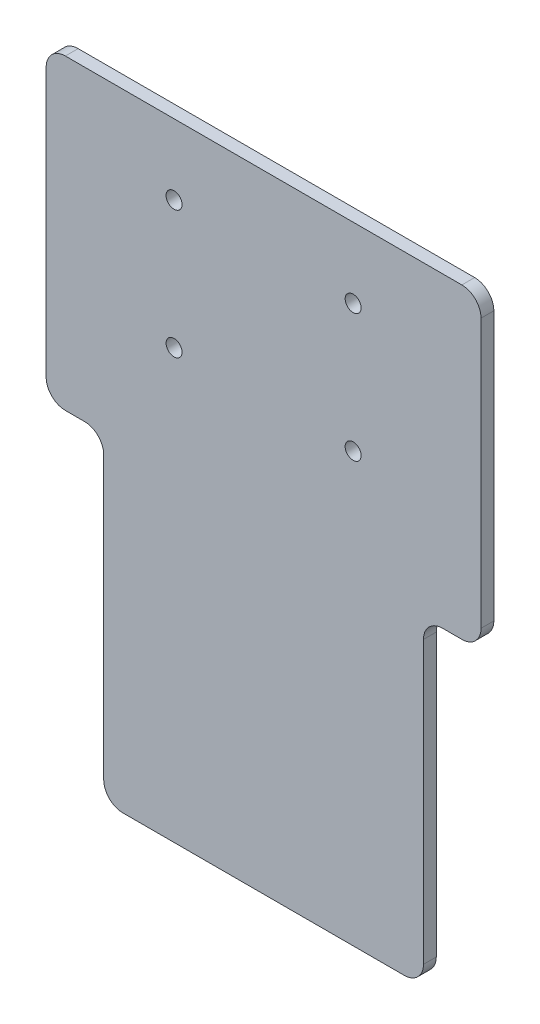
ISO-10303-21;
HEADER;
FILE_DESCRIPTION(('STEP AP214'),'2;1');
FILE_NAME('part.step','',(''),(''),'','','');
FILE_SCHEMA(('AUTOMOTIVE_DESIGN { 1 0 10303 214 1 1 1 1 }'));
ENDSEC;
DATA;
#1=APPLICATION_CONTEXT('core data for automotive mechanical design processes');
#2=APPLICATION_PROTOCOL_DEFINITION('international standard','automotive_design',2000,#1);
#3=PRODUCT_CONTEXT('',#1,'mechanical');
#4=PRODUCT('Part','Part','',(#3));
#5=PRODUCT_RELATED_PRODUCT_CATEGORY('part','',(#4));
#6=PRODUCT_DEFINITION_FORMATION('','',#4);
#7=PRODUCT_DEFINITION_CONTEXT('part definition',#1,'design');
#8=PRODUCT_DEFINITION('design','',#6,#7);
#9=PRODUCT_DEFINITION_SHAPE('','',#8);
#10=(LENGTH_UNIT() NAMED_UNIT(*) SI_UNIT(.MILLI.,.METRE.));
#11=(NAMED_UNIT(*) PLANE_ANGLE_UNIT() SI_UNIT($,.RADIAN.));
#12=(NAMED_UNIT(*) SI_UNIT($,.STERADIAN.) SOLID_ANGLE_UNIT());
#13=UNCERTAINTY_MEASURE_WITH_UNIT(LENGTH_MEASURE(1.E-05),#10,'distance_accuracy_value','');
#14=(GEOMETRIC_REPRESENTATION_CONTEXT(3) GLOBAL_UNCERTAINTY_ASSIGNED_CONTEXT((#13)) GLOBAL_UNIT_ASSIGNED_CONTEXT((#10,
#11,#12)) REPRESENTATION_CONTEXT('',''));
#15=CARTESIAN_POINT('',(0.,0.,0.));
#16=DIRECTION('',(0.,0.,1.));
#17=DIRECTION('',(1.,0.,0.));
#18=AXIS2_PLACEMENT_3D('',#15,#16,#17);
#19=CARTESIAN_POINT('',(0.,0.,2.));
#20=DIRECTION('',(0.,0.,-1.));
#21=DIRECTION('',(-1.,0.,0.));
#22=AXIS2_PLACEMENT_3D('',#19,#20,#21);
#23=PLANE('',#22);
#24=DIRECTION('',(0.,1.,0.));
#25=VECTOR('',#24,1.);
#26=CARTESIAN_POINT('',(9.,10.,2.));
#27=LINE('',#26,#25);
#28=CARTESIAN_POINT('',(9.,-37.,2.));
#29=VERTEX_POINT('',#28);
#30=CARTESIAN_POINT('',(9.,7.00000000000003,2.));
#31=VERTEX_POINT('',#30);
#32=EDGE_CURVE('E172',#29,#31,#27,.T.);
#33=ORIENTED_EDGE('',*,*,#32,.F.);
#34=CARTESIAN_POINT('',(12.,-37.,2.));
#35=DIRECTION('',(0.,0.,-1.));
#36=DIRECTION('',(-1.,0.,0.));
#37=AXIS2_PLACEMENT_3D('',#34,#35,#36);
#38=CIRCLE('',#37,3.);
#39=CARTESIAN_POINT('',(12.,-40.,2.));
#40=VERTEX_POINT('',#39);
#41=EDGE_CURVE('E279',#29,#40,#38,.F.);
#42=ORIENTED_EDGE('',*,*,#41,.T.);
#43=DIRECTION('',(1.,0.,0.));
#44=VECTOR('',#43,1.);
#45=CARTESIAN_POINT('',(-40.0499687890016,-40.,2.));
#46=LINE('',#45,#44);
#47=CARTESIAN_POINT('',(56.,-40.,2.));
#48=VERTEX_POINT('',#47);
#49=EDGE_CURVE('E223',#40,#48,#46,.T.);
#50=ORIENTED_EDGE('',*,*,#49,.T.);
#51=CARTESIAN_POINT('',(56.,-37.,2.));
#52=DIRECTION('',(0.,0.,-1.));
#53=DIRECTION('',(-1.,0.,0.));
#54=AXIS2_PLACEMENT_3D('',#51,#52,#53);
#55=CIRCLE('',#54,3.);
#56=CARTESIAN_POINT('',(59.,-37.,2.));
#57=VERTEX_POINT('',#56);
#58=EDGE_CURVE('E277',#48,#57,#55,.F.);
#59=ORIENTED_EDGE('',*,*,#58,.T.);
#60=DIRECTION('',(0.,-1.,0.));
#61=VECTOR('',#60,1.);
#62=CARTESIAN_POINT('',(59.,10.,2.));
#63=LINE('',#62,#61);
#64=CARTESIAN_POINT('',(59.,7.00000000000003,2.));
#65=VERTEX_POINT('',#64);
#66=EDGE_CURVE('E214',#65,#57,#63,.T.);
#67=ORIENTED_EDGE('',*,*,#66,.F.);
#68=CARTESIAN_POINT('',(62.,7.00000000000003,2.));
#69=DIRECTION('',(0.,0.,-1.));
#70=DIRECTION('',(-1.,0.,0.));
#71=AXIS2_PLACEMENT_3D('',#68,#69,#70);
#72=CIRCLE('',#71,3.);
#73=CARTESIAN_POINT('',(62.,10.,2.));
#74=VERTEX_POINT('',#73);
#75=EDGE_CURVE('E195',#65,#74,#72,.T.);
#76=ORIENTED_EDGE('',*,*,#75,.T.);
#77=DIRECTION('',(-1.,0.,0.));
#78=VECTOR('',#77,1.);
#79=CARTESIAN_POINT('',(68.,10.,2.));
#80=LINE('',#79,#78);
#81=CARTESIAN_POINT('',(65.,10.,2.));
#82=VERTEX_POINT('',#81);
#83=EDGE_CURVE('E211',#82,#74,#80,.T.);
#84=ORIENTED_EDGE('',*,*,#83,.F.);
#85=CARTESIAN_POINT('',(65.,13.,2.));
#86=DIRECTION('',(0.,0.,-1.));
#87=DIRECTION('',(-1.,0.,0.));
#88=AXIS2_PLACEMENT_3D('',#85,#86,#87);
#89=CIRCLE('',#88,3.);
#90=CARTESIAN_POINT('',(68.,13.,2.));
#91=VERTEX_POINT('',#90);
#92=EDGE_CURVE('E270',#82,#91,#89,.F.);
#93=ORIENTED_EDGE('',*,*,#92,.T.);
#94=DIRECTION('',(0.,1.,0.));
#95=VECTOR('',#94,1.);
#96=CARTESIAN_POINT('',(68.,0.,2.));
#97=LINE('',#96,#95);
#98=CARTESIAN_POINT('',(68.,55.,2.));
#99=VERTEX_POINT('',#98);
#100=EDGE_CURVE('E256',#91,#99,#97,.T.);
#101=ORIENTED_EDGE('',*,*,#100,.T.);
#102=CARTESIAN_POINT('',(65.,55.,2.));
#103=DIRECTION('',(0.,0.,-1.));
#104=DIRECTION('',(-1.,0.,0.));
#105=AXIS2_PLACEMENT_3D('',#102,#103,#104);
#106=CIRCLE('',#105,3.);
#107=CARTESIAN_POINT('',(65.,58.,2.));
#108=VERTEX_POINT('',#107);
#109=EDGE_CURVE('E275',#99,#108,#106,.F.);
#110=ORIENTED_EDGE('',*,*,#109,.T.);
#111=DIRECTION('',(-1.,0.,0.));
#112=VECTOR('',#111,1.);
#113=CARTESIAN_POINT('',(0.,58.,2.));
#114=LINE('',#113,#112);
#115=CARTESIAN_POINT('',(3.,58.,2.));
#116=VERTEX_POINT('',#115);
#117=EDGE_CURVE('E176',#108,#116,#114,.T.);
#118=ORIENTED_EDGE('',*,*,#117,.T.);
#119=CARTESIAN_POINT('',(3.,55.,2.));
#120=DIRECTION('',(0.,0.,-1.));
#121=DIRECTION('',(-1.,0.,0.));
#122=AXIS2_PLACEMENT_3D('',#119,#120,#121);
#123=CIRCLE('',#122,3.);
#124=CARTESIAN_POINT('',(0.,55.,2.));
#125=VERTEX_POINT('',#124);
#126=EDGE_CURVE('E273',#116,#125,#123,.F.);
#127=ORIENTED_EDGE('',*,*,#126,.T.);
#128=DIRECTION('',(0.,-1.,0.));
#129=VECTOR('',#128,1.);
#130=CARTESIAN_POINT('',(0.,0.,2.));
#131=LINE('',#130,#129);
#132=CARTESIAN_POINT('',(0.,13.,2.));
#133=VERTEX_POINT('',#132);
#134=EDGE_CURVE('E254',#125,#133,#131,.T.);
#135=ORIENTED_EDGE('',*,*,#134,.T.);
#136=CARTESIAN_POINT('',(3.,13.,2.));
#137=DIRECTION('',(0.,0.,-1.));
#138=DIRECTION('',(-1.,0.,0.));
#139=AXIS2_PLACEMENT_3D('',#136,#137,#138);
#140=CIRCLE('',#139,3.);
#141=CARTESIAN_POINT('',(3.,10.,2.));
#142=VERTEX_POINT('',#141);
#143=EDGE_CURVE('E207',#133,#142,#140,.F.);
#144=ORIENTED_EDGE('',*,*,#143,.T.);
#145=DIRECTION('',(-1.,0.,0.));
#146=VECTOR('',#145,1.);
#147=CARTESIAN_POINT('',(0.,10.,2.));
#148=LINE('',#147,#146);
#149=CARTESIAN_POINT('',(6.,10.,2.));
#150=VERTEX_POINT('',#149);
#151=EDGE_CURVE('E205',#150,#142,#148,.T.);
#152=ORIENTED_EDGE('',*,*,#151,.F.);
#153=CARTESIAN_POINT('',(6.,7.00000000000003,2.));
#154=DIRECTION('',(0.,0.,-1.));
#155=DIRECTION('',(-1.,0.,0.));
#156=AXIS2_PLACEMENT_3D('',#153,#154,#155);
#157=CIRCLE('',#156,3.);
#158=EDGE_CURVE('E57',#150,#31,#157,.T.);
#159=ORIENTED_EDGE('',*,*,#158,.T.);
#160=EDGE_LOOP('',(#33,#42,#50,#59,#67,#76,#84,#93,#101,#110,#118,#127,#135,#144,#152,#159));
#161=FACE_BOUND('',#160,.T.);
#162=CARTESIAN_POINT('',(48.,27.,2.));
#163=DIRECTION('',(0.,0.,1.));
#164=DIRECTION('',(1.,0.,0.));
#165=AXIS2_PLACEMENT_3D('',#162,#163,#164);
#166=CIRCLE('',#165,1.25);
#167=CARTESIAN_POINT('',(49.25,27.,2.));
#168=VERTEX_POINT('',#167);
#169=EDGE_CURVE('E248',#168,#168,#166,.T.);
#170=ORIENTED_EDGE('',*,*,#169,.F.);
#171=EDGE_LOOP('',(#170));
#172=FACE_BOUND('',#171,.T.);
#173=CARTESIAN_POINT('',(20.,27.,2.));
#174=DIRECTION('',(0.,0.,1.));
#175=DIRECTION('',(-1.,0.,0.));
#176=AXIS2_PLACEMENT_3D('',#173,#174,#175);
#177=CIRCLE('',#176,1.25);
#178=CARTESIAN_POINT('',(18.75,27.,2.));
#179=VERTEX_POINT('',#178);
#180=EDGE_CURVE('E242',#179,#179,#177,.T.);
#181=ORIENTED_EDGE('',*,*,#180,.F.);
#182=EDGE_LOOP('',(#181));
#183=FACE_BOUND('',#182,.T.);
#184=CARTESIAN_POINT('',(48.,47.,2.));
#185=DIRECTION('',(0.,0.,1.));
#186=DIRECTION('',(1.,0.,0.));
#187=AXIS2_PLACEMENT_3D('',#184,#185,#186);
#188=CIRCLE('',#187,1.25);
#189=CARTESIAN_POINT('',(49.25,47.,2.));
#190=VERTEX_POINT('',#189);
#191=EDGE_CURVE('E236',#190,#190,#188,.T.);
#192=ORIENTED_EDGE('',*,*,#191,.F.);
#193=EDGE_LOOP('',(#192));
#194=FACE_BOUND('',#193,.T.);
#195=CARTESIAN_POINT('',(20.,47.,2.));
#196=DIRECTION('',(0.,0.,1.));
#197=DIRECTION('',(-1.,0.,0.));
#198=AXIS2_PLACEMENT_3D('',#195,#196,#197);
#199=CIRCLE('',#198,1.25);
#200=CARTESIAN_POINT('',(18.75,47.,2.));
#201=VERTEX_POINT('',#200);
#202=EDGE_CURVE('E230',#201,#201,#199,.T.);
#203=ORIENTED_EDGE('',*,*,#202,.F.);
#204=EDGE_LOOP('',(#203));
#205=FACE_BOUND('',#204,.T.);
#206=ADVANCED_FACE('F49',(#161,#172,#183,#194,#205),#23,.F.);
#207=CARTESIAN_POINT('',(0.,0.,0.));
#208=DIRECTION('',(0.,0.,-1.));
#209=DIRECTION('',(-1.,0.,0.));
#210=AXIS2_PLACEMENT_3D('',#207,#208,#209);
#211=PLANE('',#210);
#212=DIRECTION('',(1.,0.,0.));
#213=VECTOR('',#212,1.);
#214=CARTESIAN_POINT('',(-40.0499687890016,-40.,2.79318507107451E-13));
#215=LINE('',#214,#213);
#216=CARTESIAN_POINT('',(12.,-40.,2.79318507107451E-13));
#217=VERTEX_POINT('',#216);
#218=CARTESIAN_POINT('',(56.,-40.,2.79318507107451E-13));
#219=VERTEX_POINT('',#218);
#220=EDGE_CURVE('E224',#217,#219,#215,.T.);
#221=ORIENTED_EDGE('',*,*,#220,.F.);
#222=CARTESIAN_POINT('',(12.,-37.,0.));
#223=DIRECTION('',(0.,0.,-1.));
#224=DIRECTION('',(-1.,0.,0.));
#225=AXIS2_PLACEMENT_3D('',#222,#223,#224);
#226=CIRCLE('',#225,3.);
#227=CARTESIAN_POINT('',(9.,-37.,0.));
#228=VERTEX_POINT('',#227);
#229=EDGE_CURVE('E184',#217,#228,#226,.T.);
#230=ORIENTED_EDGE('',*,*,#229,.T.);
#231=DIRECTION('',(0.,-1.,0.));
#232=VECTOR('',#231,1.);
#233=CARTESIAN_POINT('',(9.,0.,0.));
#234=LINE('',#233,#232);
#235=CARTESIAN_POINT('',(9.,7.00000000000003,0.));
#236=VERTEX_POINT('',#235);
#237=EDGE_CURVE('E169',#236,#228,#234,.T.);
#238=ORIENTED_EDGE('',*,*,#237,.F.);
#239=CARTESIAN_POINT('',(6.,7.00000000000003,0.));
#240=DIRECTION('',(0.,0.,-1.));
#241=DIRECTION('',(-1.,0.,0.));
#242=AXIS2_PLACEMENT_3D('',#239,#240,#241);
#243=CIRCLE('',#242,3.);
#244=CARTESIAN_POINT('',(6.,10.,0.));
#245=VERTEX_POINT('',#244);
#246=EDGE_CURVE('E11',#236,#245,#243,.F.);
#247=ORIENTED_EDGE('',*,*,#246,.T.);
#248=DIRECTION('',(1.,0.,0.));
#249=VECTOR('',#248,1.);
#250=CARTESIAN_POINT('',(0.,10.,0.));
#251=LINE('',#250,#249);
#252=CARTESIAN_POINT('',(3.,10.,0.));
#253=VERTEX_POINT('',#252);
#254=EDGE_CURVE('E221',#253,#245,#251,.T.);
#255=ORIENTED_EDGE('',*,*,#254,.F.);
#256=CARTESIAN_POINT('',(3.,13.,0.));
#257=DIRECTION('',(0.,0.,-1.));
#258=DIRECTION('',(-1.,0.,0.));
#259=AXIS2_PLACEMENT_3D('',#256,#257,#258);
#260=CIRCLE('',#259,3.);
#261=CARTESIAN_POINT('',(0.,13.,0.));
#262=VERTEX_POINT('',#261);
#263=EDGE_CURVE('E287',#253,#262,#260,.T.);
#264=ORIENTED_EDGE('',*,*,#263,.T.);
#265=DIRECTION('',(0.,-1.,0.));
#266=VECTOR('',#265,1.);
#267=CARTESIAN_POINT('',(0.,0.,0.));
#268=LINE('',#267,#266);
#269=CARTESIAN_POINT('',(0.,55.,0.));
#270=VERTEX_POINT('',#269);
#271=EDGE_CURVE('E251',#270,#262,#268,.T.);
#272=ORIENTED_EDGE('',*,*,#271,.F.);
#273=CARTESIAN_POINT('',(3.,55.,0.));
#274=DIRECTION('',(0.,0.,-1.));
#275=DIRECTION('',(-1.,0.,0.));
#276=AXIS2_PLACEMENT_3D('',#273,#274,#275);
#277=CIRCLE('',#276,3.);
#278=CARTESIAN_POINT('',(3.,58.,0.));
#279=VERTEX_POINT('',#278);
#280=EDGE_CURVE('E289',#270,#279,#277,.T.);
#281=ORIENTED_EDGE('',*,*,#280,.T.);
#282=DIRECTION('',(-1.,0.,0.));
#283=VECTOR('',#282,1.);
#284=CARTESIAN_POINT('',(0.,58.,0.));
#285=LINE('',#284,#283);
#286=CARTESIAN_POINT('',(65.,58.,0.));
#287=VERTEX_POINT('',#286);
#288=EDGE_CURVE('E257',#287,#279,#285,.T.);
#289=ORIENTED_EDGE('',*,*,#288,.F.);
#290=CARTESIAN_POINT('',(65.,55.,0.));
#291=DIRECTION('',(0.,0.,-1.));
#292=DIRECTION('',(-1.,0.,0.));
#293=AXIS2_PLACEMENT_3D('',#290,#291,#292);
#294=CIRCLE('',#293,3.);
#295=CARTESIAN_POINT('',(68.,55.,0.));
#296=VERTEX_POINT('',#295);
#297=EDGE_CURVE('E291',#287,#296,#294,.T.);
#298=ORIENTED_EDGE('',*,*,#297,.T.);
#299=DIRECTION('',(0.,1.,0.));
#300=VECTOR('',#299,1.);
#301=CARTESIAN_POINT('',(68.,0.,0.));
#302=LINE('',#301,#300);
#303=CARTESIAN_POINT('',(68.,13.,0.));
#304=VERTEX_POINT('',#303);
#305=EDGE_CURVE('E264',#304,#296,#302,.T.);
#306=ORIENTED_EDGE('',*,*,#305,.F.);
#307=CARTESIAN_POINT('',(65.,13.,0.));
#308=DIRECTION('',(0.,0.,-1.));
#309=DIRECTION('',(-1.,0.,0.));
#310=AXIS2_PLACEMENT_3D('',#307,#308,#309);
#311=CIRCLE('',#310,3.);
#312=CARTESIAN_POINT('',(65.,10.,0.));
#313=VERTEX_POINT('',#312);
#314=EDGE_CURVE('E285',#304,#313,#311,.T.);
#315=ORIENTED_EDGE('',*,*,#314,.T.);
#316=DIRECTION('',(1.,0.,0.));
#317=VECTOR('',#316,1.);
#318=CARTESIAN_POINT('',(0.,10.,0.));
#319=LINE('',#318,#317);
#320=CARTESIAN_POINT('',(62.,10.,0.));
#321=VERTEX_POINT('',#320);
#322=EDGE_CURVE('E185',#321,#313,#319,.T.);
#323=ORIENTED_EDGE('',*,*,#322,.F.);
#324=CARTESIAN_POINT('',(62.,7.00000000000003,0.));
#325=DIRECTION('',(0.,0.,-1.));
#326=DIRECTION('',(-1.,0.,0.));
#327=AXIS2_PLACEMENT_3D('',#324,#325,#326);
#328=CIRCLE('',#327,3.);
#329=CARTESIAN_POINT('',(59.,7.00000000000003,0.));
#330=VERTEX_POINT('',#329);
#331=EDGE_CURVE('E64',#321,#330,#328,.F.);
#332=ORIENTED_EDGE('',*,*,#331,.T.);
#333=DIRECTION('',(0.,1.,0.));
#334=VECTOR('',#333,1.);
#335=CARTESIAN_POINT('',(59.,0.,0.));
#336=LINE('',#335,#334);
#337=CARTESIAN_POINT('',(59.,-37.,0.));
#338=VERTEX_POINT('',#337);
#339=EDGE_CURVE('E186',#338,#330,#336,.T.);
#340=ORIENTED_EDGE('',*,*,#339,.F.);
#341=CARTESIAN_POINT('',(56.,-37.,0.));
#342=DIRECTION('',(0.,0.,-1.));
#343=DIRECTION('',(-1.,0.,0.));
#344=AXIS2_PLACEMENT_3D('',#341,#342,#343);
#345=CIRCLE('',#344,3.);
#346=EDGE_CURVE('E72',#338,#219,#345,.T.);
#347=ORIENTED_EDGE('',*,*,#346,.T.);
#348=EDGE_LOOP('',(#221,#230,#238,#247,#255,#264,#272,#281,#289,#298,#306,#315,#323,#332,#340,#347));
#349=FACE_BOUND('',#348,.T.);
#350=CARTESIAN_POINT('',(48.,47.,0.));
#351=DIRECTION('',(0.,0.,1.));
#352=DIRECTION('',(1.,0.,0.));
#353=AXIS2_PLACEMENT_3D('',#350,#351,#352);
#354=CIRCLE('',#353,1.25);
#355=CARTESIAN_POINT('',(49.25,47.,0.));
#356=VERTEX_POINT('',#355);
#357=EDGE_CURVE('E233',#356,#356,#354,.T.);
#358=ORIENTED_EDGE('',*,*,#357,.T.);
#359=EDGE_LOOP('',(#358));
#360=FACE_BOUND('',#359,.T.);
#361=CARTESIAN_POINT('',(48.,27.,0.));
#362=DIRECTION('',(0.,0.,1.));
#363=DIRECTION('',(1.,0.,0.));
#364=AXIS2_PLACEMENT_3D('',#361,#362,#363);
#365=CIRCLE('',#364,1.25);
#366=CARTESIAN_POINT('',(49.25,27.,0.));
#367=VERTEX_POINT('',#366);
#368=EDGE_CURVE('E245',#367,#367,#365,.T.);
#369=ORIENTED_EDGE('',*,*,#368,.T.);
#370=EDGE_LOOP('',(#369));
#371=FACE_BOUND('',#370,.T.);
#372=CARTESIAN_POINT('',(20.,27.,0.));
#373=DIRECTION('',(0.,0.,1.));
#374=DIRECTION('',(-1.,0.,0.));
#375=AXIS2_PLACEMENT_3D('',#372,#373,#374);
#376=CIRCLE('',#375,1.25);
#377=CARTESIAN_POINT('',(18.75,27.,0.));
#378=VERTEX_POINT('',#377);
#379=EDGE_CURVE('E239',#378,#378,#376,.T.);
#380=ORIENTED_EDGE('',*,*,#379,.T.);
#381=EDGE_LOOP('',(#380));
#382=FACE_BOUND('',#381,.T.);
#383=CARTESIAN_POINT('',(20.,47.,0.));
#384=DIRECTION('',(0.,0.,1.));
#385=DIRECTION('',(-1.,0.,0.));
#386=AXIS2_PLACEMENT_3D('',#383,#384,#385);
#387=CIRCLE('',#386,1.25);
#388=CARTESIAN_POINT('',(18.75,47.,0.));
#389=VERTEX_POINT('',#388);
#390=EDGE_CURVE('E227',#389,#389,#387,.T.);
#391=ORIENTED_EDGE('',*,*,#390,.T.);
#392=EDGE_LOOP('',(#391));
#393=FACE_BOUND('',#392,.T.);
#394=ADVANCED_FACE('F179',(#349,#360,#371,#382,#393),#211,.T.);
#395=CARTESIAN_POINT('',(0.,0.,2.));
#396=DIRECTION('',(1.,0.,0.));
#397=DIRECTION('',(0.,0.,-1.));
#398=AXIS2_PLACEMENT_3D('',#395,#396,#397);
#399=PLANE('',#398);
#400=ORIENTED_EDGE('',*,*,#134,.F.);
#401=DIRECTION('',(0.,0.,-1.));
#402=VECTOR('',#401,1.);
#403=CARTESIAN_POINT('',(0.,55.,2.));
#404=LINE('',#403,#402);
#405=EDGE_CURVE('E312',#125,#270,#404,.T.);
#406=ORIENTED_EDGE('',*,*,#405,.T.);
#407=ORIENTED_EDGE('',*,*,#271,.T.);
#408=DIRECTION('',(0.,0.,1.));
#409=VECTOR('',#408,1.);
#410=CARTESIAN_POINT('',(0.,13.,2.));
#411=LINE('',#410,#409);
#412=EDGE_CURVE('E309',#262,#133,#411,.T.);
#413=ORIENTED_EDGE('',*,*,#412,.T.);
#414=EDGE_LOOP('',(#400,#406,#407,#413));
#415=FACE_BOUND('',#414,.T.);
#416=ADVANCED_FACE('F355',(#415),#399,.F.);
#417=CARTESIAN_POINT('',(68.,0.,2.));
#418=DIRECTION('',(-1.,0.,0.));
#419=DIRECTION('',(0.,-1.,0.));
#420=AXIS2_PLACEMENT_3D('',#417,#418,#419);
#421=PLANE('',#420);
#422=ORIENTED_EDGE('',*,*,#305,.T.);
#423=DIRECTION('',(0.,0.,-1.));
#424=VECTOR('',#423,1.);
#425=CARTESIAN_POINT('',(68.,55.,2.));
#426=LINE('',#425,#424);
#427=EDGE_CURVE('E307',#296,#99,#426,.F.);
#428=ORIENTED_EDGE('',*,*,#427,.T.);
#429=ORIENTED_EDGE('',*,*,#100,.F.);
#430=DIRECTION('',(0.,0.,1.));
#431=VECTOR('',#430,1.);
#432=CARTESIAN_POINT('',(68.,13.,2.));
#433=LINE('',#432,#431);
#434=EDGE_CURVE('E305',#91,#304,#433,.F.);
#435=ORIENTED_EDGE('',*,*,#434,.T.);
#436=EDGE_LOOP('',(#422,#428,#429,#435));
#437=FACE_BOUND('',#436,.T.);
#438=ADVANCED_FACE('F364',(#437),#421,.F.);
#439=CARTESIAN_POINT('',(0.,58.,2.));
#440=DIRECTION('',(0.,-1.,0.));
#441=DIRECTION('',(1.,0.,0.));
#442=AXIS2_PLACEMENT_3D('',#439,#440,#441);
#443=PLANE('',#442);
#444=ORIENTED_EDGE('',*,*,#117,.F.);
#445=DIRECTION('',(0.,0.,-1.));
#446=VECTOR('',#445,1.);
#447=CARTESIAN_POINT('',(65.,58.,2.));
#448=LINE('',#447,#446);
#449=EDGE_CURVE('E302',#108,#287,#448,.T.);
#450=ORIENTED_EDGE('',*,*,#449,.T.);
#451=ORIENTED_EDGE('',*,*,#288,.T.);
#452=DIRECTION('',(0.,0.,-1.));
#453=VECTOR('',#452,1.);
#454=CARTESIAN_POINT('',(3.,58.,2.));
#455=LINE('',#454,#453);
#456=EDGE_CURVE('E300',#279,#116,#455,.F.);
#457=ORIENTED_EDGE('',*,*,#456,.T.);
#458=EDGE_LOOP('',(#444,#450,#451,#457));
#459=FACE_BOUND('',#458,.T.);
#460=ADVANCED_FACE('F361',(#459),#443,.F.);
#461=CARTESIAN_POINT('',(48.,27.,2.));
#462=DIRECTION('',(0.,0.,-1.));
#463=DIRECTION('',(-1.,0.,0.));
#464=AXIS2_PLACEMENT_3D('',#461,#462,#463);
#465=CYLINDRICAL_SURFACE('',#464,1.25);
#466=ORIENTED_EDGE('',*,*,#169,.T.);
#467=EDGE_LOOP('',(#466));
#468=FACE_BOUND('',#467,.T.);
#469=ORIENTED_EDGE('',*,*,#368,.F.);
#470=EDGE_LOOP('',(#469));
#471=FACE_BOUND('',#470,.T.);
#472=ADVANCED_FACE('F358',(#468,#471),#465,.F.);
#473=CARTESIAN_POINT('',(20.,27.,2.));
#474=DIRECTION('',(0.,0.,-1.));
#475=DIRECTION('',(-1.,0.,0.));
#476=AXIS2_PLACEMENT_3D('',#473,#474,#475);
#477=CYLINDRICAL_SURFACE('',#476,1.25);
#478=ORIENTED_EDGE('',*,*,#180,.T.);
#479=EDGE_LOOP('',(#478));
#480=FACE_BOUND('',#479,.T.);
#481=ORIENTED_EDGE('',*,*,#379,.F.);
#482=EDGE_LOOP('',(#481));
#483=FACE_BOUND('',#482,.T.);
#484=ADVANCED_FACE('F497',(#480,#483),#477,.F.);
#485=CARTESIAN_POINT('',(48.,47.,2.));
#486=DIRECTION('',(0.,0.,-1.));
#487=DIRECTION('',(-1.,0.,0.));
#488=AXIS2_PLACEMENT_3D('',#485,#486,#487);
#489=CYLINDRICAL_SURFACE('',#488,1.25);
#490=ORIENTED_EDGE('',*,*,#191,.T.);
#491=EDGE_LOOP('',(#490));
#492=FACE_BOUND('',#491,.T.);
#493=ORIENTED_EDGE('',*,*,#357,.F.);
#494=EDGE_LOOP('',(#493));
#495=FACE_BOUND('',#494,.T.);
#496=ADVANCED_FACE('F488',(#492,#495),#489,.F.);
#497=CARTESIAN_POINT('',(20.,47.,2.));
#498=DIRECTION('',(0.,0.,-1.));
#499=DIRECTION('',(-1.,0.,0.));
#500=AXIS2_PLACEMENT_3D('',#497,#498,#499);
#501=CYLINDRICAL_SURFACE('',#500,1.25);
#502=ORIENTED_EDGE('',*,*,#202,.T.);
#503=EDGE_LOOP('',(#502));
#504=FACE_BOUND('',#503,.T.);
#505=ORIENTED_EDGE('',*,*,#390,.F.);
#506=EDGE_LOOP('',(#505));
#507=FACE_BOUND('',#506,.T.);
#508=ADVANCED_FACE('F479',(#504,#507),#501,.F.);
#509=CARTESIAN_POINT('',(-40.0499687890016,-40.,2.79318507107451E-13));
#510=DIRECTION('',(0.,-1.,0.));
#511=DIRECTION('',(0.,0.,-1.));
#512=AXIS2_PLACEMENT_3D('',#509,#510,#511);
#513=PLANE('',#512);
#514=ORIENTED_EDGE('',*,*,#49,.F.);
#515=DIRECTION('',(0.,0.,1.));
#516=VECTOR('',#515,1.);
#517=CARTESIAN_POINT('',(12.,-40.,2.79290479632269E-13));
#518=LINE('',#517,#516);
#519=EDGE_CURVE('E283',#40,#217,#518,.F.);
#520=ORIENTED_EDGE('',*,*,#519,.T.);
#521=ORIENTED_EDGE('',*,*,#220,.T.);
#522=DIRECTION('',(0.,0.,-1.));
#523=VECTOR('',#522,1.);
#524=CARTESIAN_POINT('',(56.,-40.,2.));
#525=LINE('',#524,#523);
#526=EDGE_CURVE('E281',#219,#48,#525,.F.);
#527=ORIENTED_EDGE('',*,*,#526,.T.);
#528=EDGE_LOOP('',(#514,#520,#521,#527));
#529=FACE_BOUND('',#528,.T.);
#530=ADVANCED_FACE('F334',(#529),#513,.T.);
#531=CARTESIAN_POINT('',(59.,10.,-8.));
#532=DIRECTION('',(-1.,0.,0.));
#533=DIRECTION('',(0.,-1.,0.));
#534=AXIS2_PLACEMENT_3D('',#531,#532,#533);
#535=PLANE('',#534);
#536=ORIENTED_EDGE('',*,*,#66,.T.);
#537=DIRECTION('',(0.,0.,-1.));
#538=VECTOR('',#537,1.);
#539=CARTESIAN_POINT('',(59.,-37.,2.58473797920544E-13));
#540=LINE('',#539,#538);
#541=EDGE_CURVE('E298',#57,#338,#540,.T.);
#542=ORIENTED_EDGE('',*,*,#541,.T.);
#543=ORIENTED_EDGE('',*,*,#339,.T.);
#544=DIRECTION('',(0.,0.,1.));
#545=VECTOR('',#544,1.);
#546=CARTESIAN_POINT('',(59.,7.00000000000003,2.));
#547=LINE('',#546,#545);
#548=EDGE_CURVE('E295',#330,#65,#547,.T.);
#549=ORIENTED_EDGE('',*,*,#548,.T.);
#550=EDGE_LOOP('',(#536,#542,#543,#549));
#551=FACE_BOUND('',#550,.T.);
#552=ADVANCED_FACE('F329',(#551),#535,.F.);
#553=CARTESIAN_POINT('',(68.,10.,-8.));
#554=DIRECTION('',(0.,1.,0.));
#555=DIRECTION('',(-1.,0.,0.));
#556=AXIS2_PLACEMENT_3D('',#553,#554,#555);
#557=PLANE('',#556);
#558=ORIENTED_EDGE('',*,*,#83,.T.);
#559=DIRECTION('',(0.,0.,1.));
#560=VECTOR('',#559,1.);
#561=CARTESIAN_POINT('',(62.,10.,0.));
#562=LINE('',#561,#560);
#563=EDGE_CURVE('E199',#74,#321,#562,.F.);
#564=ORIENTED_EDGE('',*,*,#563,.T.);
#565=ORIENTED_EDGE('',*,*,#322,.T.);
#566=DIRECTION('',(0.,0.,1.));
#567=VECTOR('',#566,1.);
#568=CARTESIAN_POINT('',(65.,10.,-8.));
#569=LINE('',#568,#567);
#570=EDGE_CURVE('E315',#313,#82,#569,.T.);
#571=ORIENTED_EDGE('',*,*,#570,.T.);
#572=EDGE_LOOP('',(#558,#564,#565,#571));
#573=FACE_BOUND('',#572,.T.);
#574=ADVANCED_FACE('F319',(#573),#557,.F.);
#575=CARTESIAN_POINT('',(0.,10.,-8.));
#576=DIRECTION('',(0.,1.,0.));
#577=DIRECTION('',(0.,0.,1.));
#578=AXIS2_PLACEMENT_3D('',#575,#576,#577);
#579=PLANE('',#578);
#580=ORIENTED_EDGE('',*,*,#254,.T.);
#581=DIRECTION('',(0.,0.,1.));
#582=VECTOR('',#581,1.);
#583=CARTESIAN_POINT('',(6.,10.,2.));
#584=LINE('',#583,#582);
#585=EDGE_CURVE('E191',#245,#150,#584,.T.);
#586=ORIENTED_EDGE('',*,*,#585,.T.);
#587=ORIENTED_EDGE('',*,*,#151,.T.);
#588=DIRECTION('',(0.,0.,1.));
#589=VECTOR('',#588,1.);
#590=CARTESIAN_POINT('',(3.,10.,-8.));
#591=LINE('',#590,#589);
#592=EDGE_CURVE('E196',#142,#253,#591,.F.);
#593=ORIENTED_EDGE('',*,*,#592,.T.);
#594=EDGE_LOOP('',(#580,#586,#587,#593));
#595=FACE_BOUND('',#594,.T.);
#596=ADVANCED_FACE('F346',(#595),#579,.F.);
#597=CARTESIAN_POINT('',(9.,10.,-8.));
#598=DIRECTION('',(1.,0.,0.));
#599=DIRECTION('',(0.,1.,0.));
#600=AXIS2_PLACEMENT_3D('',#597,#598,#599);
#601=PLANE('',#600);
#602=ORIENTED_EDGE('',*,*,#237,.T.);
#603=DIRECTION('',(0.,0.,1.));
#604=VECTOR('',#603,1.);
#605=CARTESIAN_POINT('',(9.,-37.,1.99999999999998));
#606=LINE('',#605,#604);
#607=EDGE_CURVE('E175',#228,#29,#606,.T.);
#608=ORIENTED_EDGE('',*,*,#607,.T.);
#609=ORIENTED_EDGE('',*,*,#32,.T.);
#610=DIRECTION('',(0.,0.,1.));
#611=VECTOR('',#610,1.);
#612=CARTESIAN_POINT('',(9.,7.00000000000003,0.));
#613=LINE('',#612,#611);
#614=EDGE_CURVE('E165',#31,#236,#613,.F.);
#615=ORIENTED_EDGE('',*,*,#614,.T.);
#616=EDGE_LOOP('',(#602,#608,#609,#615));
#617=FACE_BOUND('',#616,.T.);
#618=ADVANCED_FACE('F167',(#617),#601,.F.);
#619=CARTESIAN_POINT('',(12.,-37.,-7.99999999999967));
#620=DIRECTION('',(0.,0.,-1.));
#621=DIRECTION('',(0.,1.,0.));
#622=AXIS2_PLACEMENT_3D('',#619,#620,#621);
#623=CYLINDRICAL_SURFACE('',#622,3.);
#624=ORIENTED_EDGE('',*,*,#229,.F.);
#625=ORIENTED_EDGE('',*,*,#519,.F.);
#626=ORIENTED_EDGE('',*,*,#41,.F.);
#627=ORIENTED_EDGE('',*,*,#607,.F.);
#628=EDGE_LOOP('',(#624,#625,#626,#627));
#629=FACE_BOUND('',#628,.T.);
#630=ADVANCED_FACE('F337',(#629),#623,.T.);
#631=CARTESIAN_POINT('',(56.,-37.,-7.99999999999967));
#632=DIRECTION('',(0.,0.,1.));
#633=DIRECTION('',(0.,-1.,0.));
#634=AXIS2_PLACEMENT_3D('',#631,#632,#633);
#635=CYLINDRICAL_SURFACE('',#634,3.);
#636=ORIENTED_EDGE('',*,*,#58,.F.);
#637=ORIENTED_EDGE('',*,*,#526,.F.);
#638=ORIENTED_EDGE('',*,*,#346,.F.);
#639=ORIENTED_EDGE('',*,*,#541,.F.);
#640=EDGE_LOOP('',(#636,#637,#638,#639));
#641=FACE_BOUND('',#640,.T.);
#642=ADVANCED_FACE('F332',(#641),#635,.T.);
#643=CARTESIAN_POINT('',(65.,55.,2.));
#644=DIRECTION('',(0.,0.,-1.));
#645=DIRECTION('',(-1.,0.,0.));
#646=AXIS2_PLACEMENT_3D('',#643,#644,#645);
#647=CYLINDRICAL_SURFACE('',#646,3.);
#648=ORIENTED_EDGE('',*,*,#109,.F.);
#649=ORIENTED_EDGE('',*,*,#427,.F.);
#650=ORIENTED_EDGE('',*,*,#297,.F.);
#651=ORIENTED_EDGE('',*,*,#449,.F.);
#652=EDGE_LOOP('',(#648,#649,#650,#651));
#653=FACE_BOUND('',#652,.T.);
#654=ADVANCED_FACE('F344',(#653),#647,.T.);
#655=CARTESIAN_POINT('',(3.,55.,2.));
#656=DIRECTION('',(0.,0.,-1.));
#657=DIRECTION('',(-1.,0.,0.));
#658=AXIS2_PLACEMENT_3D('',#655,#656,#657);
#659=CYLINDRICAL_SURFACE('',#658,3.);
#660=ORIENTED_EDGE('',*,*,#126,.F.);
#661=ORIENTED_EDGE('',*,*,#456,.F.);
#662=ORIENTED_EDGE('',*,*,#280,.F.);
#663=ORIENTED_EDGE('',*,*,#405,.F.);
#664=EDGE_LOOP('',(#660,#661,#662,#663));
#665=FACE_BOUND('',#664,.T.);
#666=ADVANCED_FACE('F378',(#665),#659,.T.);
#667=CARTESIAN_POINT('',(62.,7.00000000000003,-8.));
#668=DIRECTION('',(0.,0.,-1.));
#669=DIRECTION('',(-1.,0.,0.));
#670=AXIS2_PLACEMENT_3D('',#667,#668,#669);
#671=CYLINDRICAL_SURFACE('',#670,3.);
#672=ORIENTED_EDGE('',*,*,#331,.F.);
#673=ORIENTED_EDGE('',*,*,#563,.F.);
#674=ORIENTED_EDGE('',*,*,#75,.F.);
#675=ORIENTED_EDGE('',*,*,#548,.F.);
#676=EDGE_LOOP('',(#672,#673,#674,#675));
#677=FACE_BOUND('',#676,.T.);
#678=ADVANCED_FACE('F326',(#677),#671,.F.);
#679=CARTESIAN_POINT('',(6.,7.00000000000003,-8.));
#680=DIRECTION('',(0.,0.,-1.));
#681=DIRECTION('',(-1.,0.,0.));
#682=AXIS2_PLACEMENT_3D('',#679,#680,#681);
#683=CYLINDRICAL_SURFACE('',#682,3.);
#684=ORIENTED_EDGE('',*,*,#246,.F.);
#685=ORIENTED_EDGE('',*,*,#614,.F.);
#686=ORIENTED_EDGE('',*,*,#158,.F.);
#687=ORIENTED_EDGE('',*,*,#585,.F.);
#688=EDGE_LOOP('',(#684,#685,#686,#687));
#689=FACE_BOUND('',#688,.T.);
#690=ADVANCED_FACE('F189',(#689),#683,.F.);
#691=CARTESIAN_POINT('',(3.,13.,2.));
#692=DIRECTION('',(0.,0.,1.));
#693=DIRECTION('',(1.,0.,0.));
#694=AXIS2_PLACEMENT_3D('',#691,#692,#693);
#695=CYLINDRICAL_SURFACE('',#694,3.);
#696=ORIENTED_EDGE('',*,*,#263,.F.);
#697=ORIENTED_EDGE('',*,*,#592,.F.);
#698=ORIENTED_EDGE('',*,*,#143,.F.);
#699=ORIENTED_EDGE('',*,*,#412,.F.);
#700=EDGE_LOOP('',(#696,#697,#698,#699));
#701=FACE_BOUND('',#700,.T.);
#702=ADVANCED_FACE('F390',(#701),#695,.T.);
#703=CARTESIAN_POINT('',(65.,13.,-8.));
#704=DIRECTION('',(0.,0.,1.));
#705=DIRECTION('',(1.,0.,0.));
#706=AXIS2_PLACEMENT_3D('',#703,#704,#705);
#707=CYLINDRICAL_SURFACE('',#706,3.);
#708=ORIENTED_EDGE('',*,*,#314,.F.);
#709=ORIENTED_EDGE('',*,*,#434,.F.);
#710=ORIENTED_EDGE('',*,*,#92,.F.);
#711=ORIENTED_EDGE('',*,*,#570,.F.);
#712=EDGE_LOOP('',(#708,#709,#710,#711));
#713=FACE_BOUND('',#712,.T.);
#714=ADVANCED_FACE('F51',(#713),#707,.T.);
#715=CLOSED_SHELL('',(#206,#394,#416,#438,#460,#472,#484,#496,#508,#530,#552,#574,#596,#618,
#630,#642,#654,#666,#678,#690,#702,#714));
#716=MANIFOLD_SOLID_BREP('B2',#715);
#717=ADVANCED_BREP_SHAPE_REPRESENTATION('',(#18,#716),#14);
#718=SHAPE_DEFINITION_REPRESENTATION(#9,#717);
ENDSEC;
END-ISO-10303-21;
